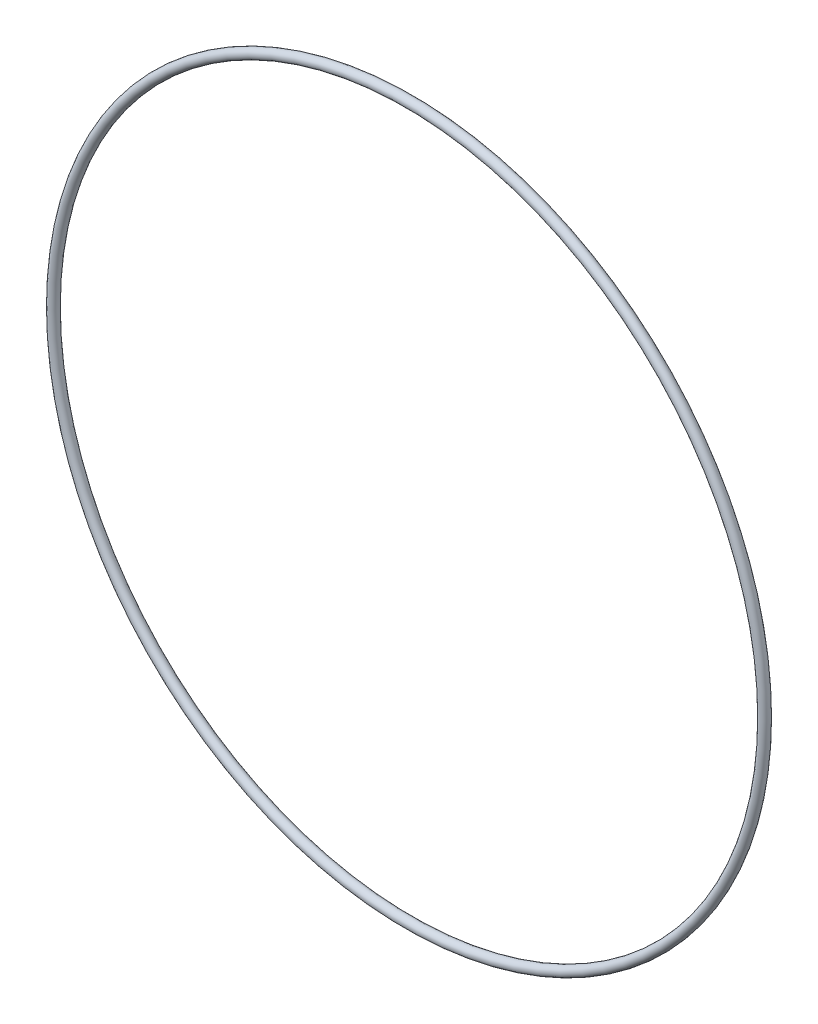
ISO-10303-21;
HEADER;
FILE_DESCRIPTION(('STEP AP214'),'2;1');
FILE_NAME('part.step','',(''),(''),'','','');
FILE_SCHEMA(('AUTOMOTIVE_DESIGN { 1 0 10303 214 1 1 1 1 }'));
ENDSEC;
DATA;
#1=APPLICATION_CONTEXT('core data for automotive mechanical design processes');
#2=APPLICATION_PROTOCOL_DEFINITION('international standard','automotive_design',2000,#1);
#3=PRODUCT_CONTEXT('',#1,'mechanical');
#4=PRODUCT('Part','Part','',(#3));
#5=PRODUCT_RELATED_PRODUCT_CATEGORY('part','',(#4));
#6=PRODUCT_DEFINITION_FORMATION('','',#4);
#7=PRODUCT_DEFINITION_CONTEXT('part definition',#1,'design');
#8=PRODUCT_DEFINITION('design','',#6,#7);
#9=PRODUCT_DEFINITION_SHAPE('','',#8);
#10=(LENGTH_UNIT() NAMED_UNIT(*) SI_UNIT(.MILLI.,.METRE.));
#11=(NAMED_UNIT(*) PLANE_ANGLE_UNIT() SI_UNIT($,.RADIAN.));
#12=(NAMED_UNIT(*) SI_UNIT($,.STERADIAN.) SOLID_ANGLE_UNIT());
#13=UNCERTAINTY_MEASURE_WITH_UNIT(LENGTH_MEASURE(1.E-05),#10,'distance_accuracy_value','');
#14=(GEOMETRIC_REPRESENTATION_CONTEXT(3) GLOBAL_UNCERTAINTY_ASSIGNED_CONTEXT((#13)) GLOBAL_UNIT_ASSIGNED_CONTEXT((#10,
#11,#12)) REPRESENTATION_CONTEXT('',''));
#15=CARTESIAN_POINT('',(0.,0.,0.));
#16=DIRECTION('',(0.,0.,1.));
#17=DIRECTION('',(1.,0.,0.));
#18=AXIS2_PLACEMENT_3D('',#15,#16,#17);
#19=CARTESIAN_POINT('',(0.,0.,0.));
#20=DIRECTION('',(0.,0.,1.));
#21=DIRECTION('',(1.,0.,0.));
#22=AXIS2_PLACEMENT_3D('',#19,#20,#21);
#23=TOROIDAL_SURFACE('',#22,72.5,1.);
#24=CARTESIAN_POINT('',(73.5,0.,0.));
#25=VERTEX_POINT('',#24);
#26=VERTEX_LOOP('',#25);
#27=FACE_BOUND('',#26,.T.);
#28=ADVANCED_FACE('F35',(#27),#23,.T.);
#29=CLOSED_SHELL('',(#28));
#30=MANIFOLD_SOLID_BREP('B2',#29);
#31=ADVANCED_BREP_SHAPE_REPRESENTATION('',(#18,#30),#14);
#32=SHAPE_DEFINITION_REPRESENTATION(#9,#31);
ENDSEC;
END-ISO-10303-21;
